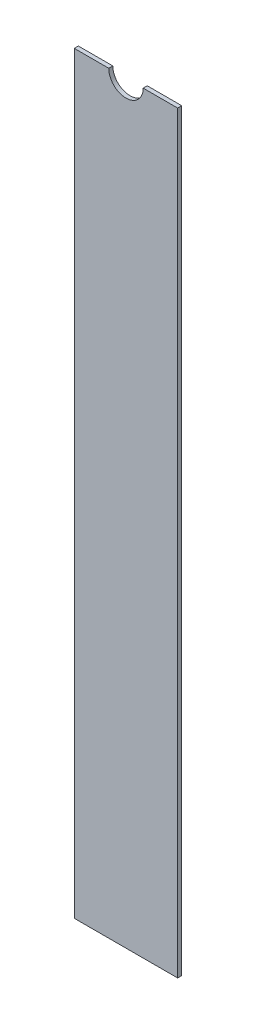
ISO-10303-21;
HEADER;
FILE_DESCRIPTION(('STEP AP214'),'2;1');
FILE_NAME('part.step','',(''),(''),'','','');
FILE_SCHEMA(('AUTOMOTIVE_DESIGN { 1 0 10303 214 1 1 1 1 }'));
ENDSEC;
DATA;
#1=APPLICATION_CONTEXT('core data for automotive mechanical design processes');
#2=APPLICATION_PROTOCOL_DEFINITION('international standard','automotive_design',2000,#1);
#3=PRODUCT_CONTEXT('',#1,'mechanical');
#4=PRODUCT('Part','Part','',(#3));
#5=PRODUCT_RELATED_PRODUCT_CATEGORY('part','',(#4));
#6=PRODUCT_DEFINITION_FORMATION('','',#4);
#7=PRODUCT_DEFINITION_CONTEXT('part definition',#1,'design');
#8=PRODUCT_DEFINITION('design','',#6,#7);
#9=PRODUCT_DEFINITION_SHAPE('','',#8);
#10=(LENGTH_UNIT() NAMED_UNIT(*) SI_UNIT(.MILLI.,.METRE.));
#11=(NAMED_UNIT(*) PLANE_ANGLE_UNIT() SI_UNIT($,.RADIAN.));
#12=(NAMED_UNIT(*) SI_UNIT($,.STERADIAN.) SOLID_ANGLE_UNIT());
#13=UNCERTAINTY_MEASURE_WITH_UNIT(LENGTH_MEASURE(1.E-05),#10,'distance_accuracy_value','');
#14=(GEOMETRIC_REPRESENTATION_CONTEXT(3) GLOBAL_UNCERTAINTY_ASSIGNED_CONTEXT((#13)) GLOBAL_UNIT_ASSIGNED_CONTEXT((#10,
#11,#12)) REPRESENTATION_CONTEXT('',''));
#15=CARTESIAN_POINT('',(0.,0.,0.));
#16=DIRECTION('',(0.,0.,1.));
#17=DIRECTION('',(1.,0.,0.));
#18=AXIS2_PLACEMENT_3D('',#15,#16,#17);
#19=CARTESIAN_POINT('',(0.,0.,3.));
#20=DIRECTION('',(0.,0.,1.));
#21=DIRECTION('',(1.,0.,0.));
#22=AXIS2_PLACEMENT_3D('',#19,#20,#21);
#23=PLANE('',#22);
#24=DIRECTION('',(1.,0.,0.));
#25=VECTOR('',#24,1.);
#26=CARTESIAN_POINT('',(-38.1,555.422808861103,3.));
#27=LINE('',#26,#25);
#28=CARTESIAN_POINT('',(-38.1,555.422808861103,3.));
#29=VERTEX_POINT('',#28);
#30=CARTESIAN_POINT('',(-12.7,555.422808861103,3.));
#31=VERTEX_POINT('',#30);
#32=EDGE_CURVE('E62',#29,#31,#27,.T.);
#33=ORIENTED_EDGE('',*,*,#32,.F.);
#34=DIRECTION('',(0.,-1.,0.));
#35=VECTOR('',#34,1.);
#36=CARTESIAN_POINT('',(-38.1,584.2,3.));
#37=LINE('',#36,#35);
#38=CARTESIAN_POINT('',(-38.0999999999999,0.,3.));
#39=VERTEX_POINT('',#38);
#40=EDGE_CURVE('E106',#29,#39,#37,.T.);
#41=ORIENTED_EDGE('',*,*,#40,.T.);
#42=DIRECTION('',(1.,0.,0.));
#43=VECTOR('',#42,1.);
#44=CARTESIAN_POINT('',(38.1000000000001,0.,3.));
#45=LINE('',#44,#43);
#46=CARTESIAN_POINT('',(38.1000000000001,0.,3.));
#47=VERTEX_POINT('',#46);
#48=EDGE_CURVE('E131',#39,#47,#45,.T.);
#49=ORIENTED_EDGE('',*,*,#48,.T.);
#50=DIRECTION('',(0.,1.,0.));
#51=VECTOR('',#50,1.);
#52=CARTESIAN_POINT('',(38.1000000000001,0.,3.));
#53=LINE('',#52,#51);
#54=CARTESIAN_POINT('',(38.1000000000001,555.422808861103,3.));
#55=VERTEX_POINT('',#54);
#56=EDGE_CURVE('E119',#47,#55,#53,.T.);
#57=ORIENTED_EDGE('',*,*,#56,.T.);
#58=CARTESIAN_POINT('',(12.7,555.422808861103,3.));
#59=VERTEX_POINT('',#58);
#60=EDGE_CURVE('E136',#59,#55,#27,.T.);
#61=ORIENTED_EDGE('',*,*,#60,.F.);
#62=CARTESIAN_POINT('',(0.,555.422808861103,3.));
#63=DIRECTION('',(0.,0.,1.));
#64=DIRECTION('',(1.,0.,0.));
#65=AXIS2_PLACEMENT_3D('',#62,#63,#64);
#66=CIRCLE('',#65,12.7);
#67=EDGE_CURVE('E122',#31,#59,#66,.T.);
#68=ORIENTED_EDGE('',*,*,#67,.F.);
#69=EDGE_LOOP('',(#33,#41,#49,#57,#61,#68));
#70=FACE_BOUND('',#69,.T.);
#71=ADVANCED_FACE('F39',(#70),#23,.T.);
#72=CARTESIAN_POINT('',(0.,0.,0.));
#73=DIRECTION('',(0.,0.,1.));
#74=DIRECTION('',(1.,0.,0.));
#75=AXIS2_PLACEMENT_3D('',#72,#73,#74);
#76=PLANE('',#75);
#77=DIRECTION('',(0.,-1.,0.));
#78=VECTOR('',#77,1.);
#79=CARTESIAN_POINT('',(-38.1,584.2,0.));
#80=LINE('',#79,#78);
#81=CARTESIAN_POINT('',(-38.1,555.422808861103,0.));
#82=VERTEX_POINT('',#81);
#83=CARTESIAN_POINT('',(-38.0999999999999,0.,0.));
#84=VERTEX_POINT('',#83);
#85=EDGE_CURVE('E104',#82,#84,#80,.T.);
#86=ORIENTED_EDGE('',*,*,#85,.F.);
#87=DIRECTION('',(1.,0.,0.));
#88=VECTOR('',#87,1.);
#89=CARTESIAN_POINT('',(-38.1,555.422808861103,0.));
#90=LINE('',#89,#88);
#91=CARTESIAN_POINT('',(-12.7,555.422808861103,0.));
#92=VERTEX_POINT('',#91);
#93=EDGE_CURVE('E90',#82,#92,#90,.T.);
#94=ORIENTED_EDGE('',*,*,#93,.T.);
#95=CARTESIAN_POINT('',(0.,555.422808861103,0.));
#96=DIRECTION('',(0.,0.,1.));
#97=DIRECTION('',(1.,0.,0.));
#98=AXIS2_PLACEMENT_3D('',#95,#96,#97);
#99=CIRCLE('',#98,12.7);
#100=CARTESIAN_POINT('',(12.7,555.422808861103,0.));
#101=VERTEX_POINT('',#100);
#102=EDGE_CURVE('E148',#92,#101,#99,.T.);
#103=ORIENTED_EDGE('',*,*,#102,.T.);
#104=CARTESIAN_POINT('',(38.1000000000001,555.422808861103,0.));
#105=VERTEX_POINT('',#104);
#106=EDGE_CURVE('E55',#101,#105,#90,.T.);
#107=ORIENTED_EDGE('',*,*,#106,.T.);
#108=DIRECTION('',(0.,1.,0.));
#109=VECTOR('',#108,1.);
#110=CARTESIAN_POINT('',(38.1000000000001,0.,0.));
#111=LINE('',#110,#109);
#112=CARTESIAN_POINT('',(38.1000000000001,0.,0.));
#113=VERTEX_POINT('',#112);
#114=EDGE_CURVE('E115',#113,#105,#111,.T.);
#115=ORIENTED_EDGE('',*,*,#114,.F.);
#116=DIRECTION('',(1.,0.,0.));
#117=VECTOR('',#116,1.);
#118=CARTESIAN_POINT('',(38.1000000000001,0.,0.));
#119=LINE('',#118,#117);
#120=EDGE_CURVE('E113',#84,#113,#119,.T.);
#121=ORIENTED_EDGE('',*,*,#120,.F.);
#122=EDGE_LOOP('',(#86,#94,#103,#107,#115,#121));
#123=FACE_BOUND('',#122,.T.);
#124=ADVANCED_FACE('F111',(#123),#76,.F.);
#125=CARTESIAN_POINT('',(38.1000000000001,0.,3.));
#126=DIRECTION('',(-1.,0.,0.));
#127=DIRECTION('',(0.,-1.,0.));
#128=AXIS2_PLACEMENT_3D('',#125,#126,#127);
#129=PLANE('',#128);
#130=ORIENTED_EDGE('',*,*,#114,.T.);
#131=DIRECTION('',(0.,0.,1.));
#132=VECTOR('',#131,1.);
#133=CARTESIAN_POINT('',(38.1000000000001,555.422808861103,0.));
#134=LINE('',#133,#132);
#135=EDGE_CURVE('E108',#105,#55,#134,.T.);
#136=ORIENTED_EDGE('',*,*,#135,.T.);
#137=ORIENTED_EDGE('',*,*,#56,.F.);
#138=DIRECTION('',(0.,0.,-1.));
#139=VECTOR('',#138,1.);
#140=CARTESIAN_POINT('',(38.1000000000001,0.,3.));
#141=LINE('',#140,#139);
#142=EDGE_CURVE('E126',#47,#113,#141,.T.);
#143=ORIENTED_EDGE('',*,*,#142,.T.);
#144=EDGE_LOOP('',(#130,#136,#137,#143));
#145=FACE_BOUND('',#144,.T.);
#146=ADVANCED_FACE('F41',(#145),#129,.F.);
#147=CARTESIAN_POINT('',(-38.1,584.2,3.));
#148=DIRECTION('',(1.,0.,0.));
#149=DIRECTION('',(0.,1.,0.));
#150=AXIS2_PLACEMENT_3D('',#147,#148,#149);
#151=PLANE('',#150);
#152=ORIENTED_EDGE('',*,*,#40,.F.);
#153=DIRECTION('',(0.,0.,1.));
#154=VECTOR('',#153,1.);
#155=CARTESIAN_POINT('',(-38.1,555.422808861103,0.));
#156=LINE('',#155,#154);
#157=EDGE_CURVE('E93',#82,#29,#156,.T.);
#158=ORIENTED_EDGE('',*,*,#157,.F.);
#159=ORIENTED_EDGE('',*,*,#85,.T.);
#160=DIRECTION('',(0.,0.,-1.));
#161=VECTOR('',#160,1.);
#162=CARTESIAN_POINT('',(-38.0999999999999,0.,3.));
#163=LINE('',#162,#161);
#164=EDGE_CURVE('E130',#39,#84,#163,.T.);
#165=ORIENTED_EDGE('',*,*,#164,.F.);
#166=EDGE_LOOP('',(#152,#158,#159,#165));
#167=FACE_BOUND('',#166,.T.);
#168=ADVANCED_FACE('F102',(#167),#151,.F.);
#169=CARTESIAN_POINT('',(38.1000000000001,0.,3.));
#170=DIRECTION('',(0.,1.,0.));
#171=DIRECTION('',(-1.,0.,0.));
#172=AXIS2_PLACEMENT_3D('',#169,#170,#171);
#173=PLANE('',#172);
#174=ORIENTED_EDGE('',*,*,#120,.T.);
#175=ORIENTED_EDGE('',*,*,#142,.F.);
#176=ORIENTED_EDGE('',*,*,#48,.F.);
#177=ORIENTED_EDGE('',*,*,#164,.T.);
#178=EDGE_LOOP('',(#174,#175,#176,#177));
#179=FACE_BOUND('',#178,.T.);
#180=ADVANCED_FACE('F161',(#179),#173,.F.);
#181=CARTESIAN_POINT('',(0.,555.422808861103,3.));
#182=DIRECTION('',(0.,0.,-1.));
#183=DIRECTION('',(-1.,0.,0.));
#184=AXIS2_PLACEMENT_3D('',#181,#182,#183);
#185=CYLINDRICAL_SURFACE('',#184,12.7);
#186=DIRECTION('',(0.,0.,-1.));
#187=VECTOR('',#186,1.);
#188=CARTESIAN_POINT('',(-12.7,555.422808861103,3.));
#189=LINE('',#188,#187);
#190=EDGE_CURVE('E11',#31,#92,#189,.T.);
#191=ORIENTED_EDGE('',*,*,#190,.F.);
#192=ORIENTED_EDGE('',*,*,#67,.T.);
#193=DIRECTION('',(0.,0.,-1.));
#194=VECTOR('',#193,1.);
#195=CARTESIAN_POINT('',(12.7,555.422808861103,3.));
#196=LINE('',#195,#194);
#197=EDGE_CURVE('E48',#101,#59,#196,.F.);
#198=ORIENTED_EDGE('',*,*,#197,.F.);
#199=ORIENTED_EDGE('',*,*,#102,.F.);
#200=EDGE_LOOP('',(#191,#192,#198,#199));
#201=FACE_BOUND('',#200,.T.);
#202=ADVANCED_FACE('F146',(#201),#185,.F.);
#203=CARTESIAN_POINT('',(-38.1,555.422808861103,0.));
#204=DIRECTION('',(0.,-1.,0.));
#205=DIRECTION('',(0.,0.,-1.));
#206=AXIS2_PLACEMENT_3D('',#203,#204,#205);
#207=PLANE('',#206);
#208=ORIENTED_EDGE('',*,*,#197,.T.);
#209=ORIENTED_EDGE('',*,*,#60,.T.);
#210=ORIENTED_EDGE('',*,*,#135,.F.);
#211=ORIENTED_EDGE('',*,*,#106,.F.);
#212=EDGE_LOOP('',(#208,#209,#210,#211));
#213=FACE_BOUND('',#212,.T.);
#214=ADVANCED_FACE('F135',(#213),#207,.F.);
#215=ORIENTED_EDGE('',*,*,#190,.T.);
#216=ORIENTED_EDGE('',*,*,#93,.F.);
#217=ORIENTED_EDGE('',*,*,#157,.T.);
#218=ORIENTED_EDGE('',*,*,#32,.T.);
#219=EDGE_LOOP('',(#215,#216,#217,#218));
#220=FACE_BOUND('',#219,.T.);
#221=ADVANCED_FACE('F92',(#220),#207,.F.);
#222=CLOSED_SHELL('',(#71,#124,#146,#168,#180,#202,#214,#221));
#223=MANIFOLD_SOLID_BREP('B2',#222);
#224=ADVANCED_BREP_SHAPE_REPRESENTATION('',(#18,#223),#14);
#225=SHAPE_DEFINITION_REPRESENTATION(#9,#224);
ENDSEC;
END-ISO-10303-21;
